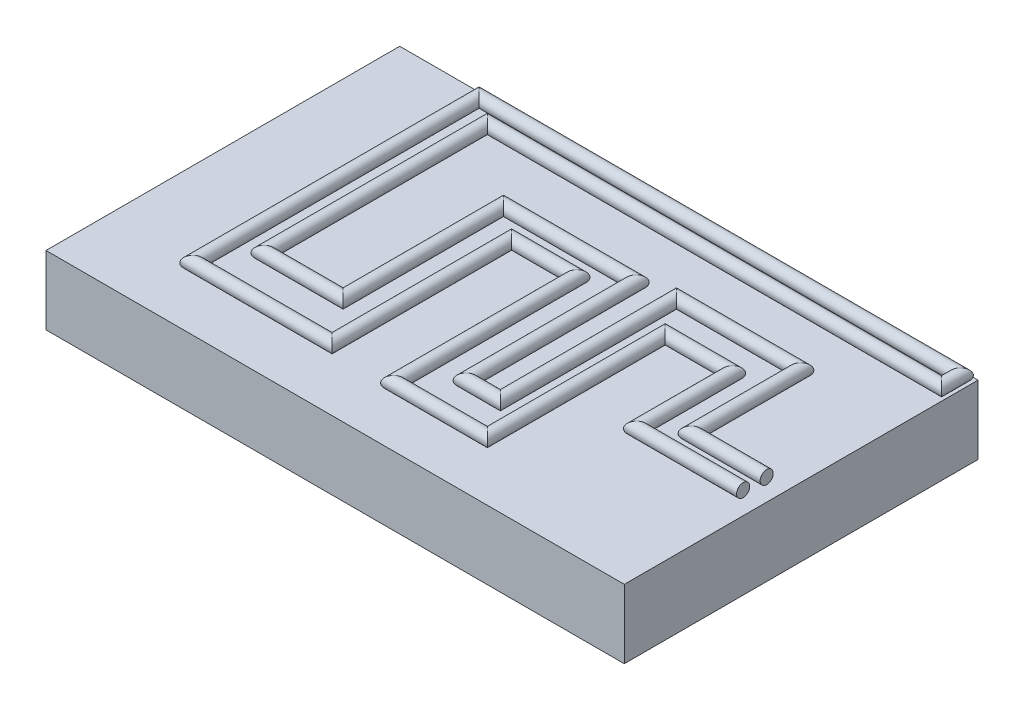
ISO-10303-21;
HEADER;
FILE_DESCRIPTION(('STEP AP214'),'2;1');
FILE_NAME('part.step','',(''),(''),'','','');
FILE_SCHEMA(('AUTOMOTIVE_DESIGN { 1 0 10303 214 1 1 1 1 }'));
ENDSEC;
DATA;
#1=APPLICATION_CONTEXT('core data for automotive mechanical design processes');
#2=APPLICATION_PROTOCOL_DEFINITION('international standard','automotive_design',2000,#1);
#3=PRODUCT_CONTEXT('',#1,'mechanical');
#4=PRODUCT('Part','Part','',(#3));
#5=PRODUCT_RELATED_PRODUCT_CATEGORY('part','',(#4));
#6=PRODUCT_DEFINITION_FORMATION('','',#4);
#7=PRODUCT_DEFINITION_CONTEXT('part definition',#1,'design');
#8=PRODUCT_DEFINITION('design','',#6,#7);
#9=PRODUCT_DEFINITION_SHAPE('','',#8);
#10=(LENGTH_UNIT() NAMED_UNIT(*) SI_UNIT(.MILLI.,.METRE.));
#11=(NAMED_UNIT(*) PLANE_ANGLE_UNIT() SI_UNIT($,.RADIAN.));
#12=(NAMED_UNIT(*) SI_UNIT($,.STERADIAN.) SOLID_ANGLE_UNIT());
#13=UNCERTAINTY_MEASURE_WITH_UNIT(LENGTH_MEASURE(1.E-05),#10,'distance_accuracy_value','');
#14=(GEOMETRIC_REPRESENTATION_CONTEXT(3) GLOBAL_UNCERTAINTY_ASSIGNED_CONTEXT((#13)) GLOBAL_UNIT_ASSIGNED_CONTEXT((#10,
#11,#12)) REPRESENTATION_CONTEXT('',''));
#15=CARTESIAN_POINT('',(0.,0.,0.));
#16=DIRECTION('',(0.,0.,1.));
#17=DIRECTION('',(1.,0.,0.));
#18=AXIS2_PLACEMENT_3D('',#15,#16,#17);
#19=CARTESIAN_POINT('',(61.7814006041099,9.64904990568815,-15.2359557336664));
#20=DIRECTION('',(-1.,0.,0.));
#21=DIRECTION('',(0.,-1.,0.));
#22=AXIS2_PLACEMENT_3D('',#19,#20,#21);
#23=PLANE('',#22);
#24=CARTESIAN_POINT('',(61.7814006041099,9.64904990568815,-15.2359557336664));
#25=DIRECTION('',(-1.,0.,0.));
#26=DIRECTION('',(0.,-1.,0.));
#27=AXIS2_PLACEMENT_3D('',#24,#25,#26);
#28=CIRCLE('',#27,0.699999999999999);
#29=CARTESIAN_POINT('',(61.7814006041099,8.94904990568815,-15.2359557336664));
#30=VERTEX_POINT('',#29);
#31=EDGE_CURVE('E68',#30,#30,#28,.T.);
#32=ORIENTED_EDGE('',*,*,#31,.F.);
#33=EDGE_LOOP('',(#32));
#34=FACE_BOUND('',#33,.T.);
#35=ADVANCED_FACE('F63',(#34),#23,.F.);
#36=CARTESIAN_POINT('',(61.733496817494,9.64904990568808,-12.7677870986393));
#37=DIRECTION('',(1.,0.,0.));
#38=DIRECTION('',(0.,-1.,0.));
#39=AXIS2_PLACEMENT_3D('',#36,#37,#38);
#40=PLANE('',#39);
#41=CARTESIAN_POINT('',(61.733496817494,9.64904990568808,-12.7677870986393));
#42=DIRECTION('',(1.,0.,0.));
#43=DIRECTION('',(0.,-1.,0.));
#44=AXIS2_PLACEMENT_3D('',#41,#42,#43);
#45=CIRCLE('',#44,0.699999999999999);
#46=CARTESIAN_POINT('',(61.733496817494,8.94904990568808,-12.7677870986393));
#47=VERTEX_POINT('',#46);
#48=EDGE_CURVE('E75',#47,#47,#45,.T.);
#49=ORIENTED_EDGE('',*,*,#48,.T.);
#50=EDGE_LOOP('',(#49));
#51=FACE_BOUND('',#50,.T.);
#52=ADVANCED_FACE('F149',(#51),#40,.T.);
#53=CARTESIAN_POINT('',(52.077721611781,9.64904990568816,-15.2359557336664));
#54=DIRECTION('',(1.,0.,0.));
#55=DIRECTION('',(0.,1.,0.));
#56=AXIS2_PLACEMENT_3D('',#53,#54,#55);
#57=CYLINDRICAL_SURFACE('',#56,0.699999999999999);
#58=CARTESIAN_POINT('',(53.717721611781,9.64904990568816,-15.2359557336664));
#59=DIRECTION('',(0.707106781186547,0.,0.707106781186547));
#60=DIRECTION('',(-0.707106781186548,0.,0.707106781186548));
#61=AXIS2_PLACEMENT_3D('',#58,#59,#60);
#62=ELLIPSE('',#61,0.989949493661166,0.699999999999999);
#63=CARTESIAN_POINT('',(53.017721611781,9.64904990568816,-14.5359557336664));
#64=VERTEX_POINT('',#63);
#65=EDGE_CURVE('E136',#64,#64,#62,.T.);
#66=ORIENTED_EDGE('',*,*,#65,.T.);
#67=EDGE_LOOP('',(#66));
#68=FACE_BOUND('',#67,.T.);
#69=ORIENTED_EDGE('',*,*,#31,.T.);
#70=EDGE_LOOP('',(#69));
#71=FACE_BOUND('',#70,.T.);
#72=ADVANCED_FACE('F143',(#68,#71),#57,.T.);
#73=CARTESIAN_POINT('',(53.717721611781,9.64904990568816,-28.5779597002349));
#74=DIRECTION('',(0.,0.,1.));
#75=DIRECTION('',(1.,0.,0.));
#76=AXIS2_PLACEMENT_3D('',#73,#74,#75);
#77=CYLINDRICAL_SURFACE('',#76,0.699999999999999);
#78=CARTESIAN_POINT('',(53.717721611781,9.64904990568818,-26.9379597002349));
#79=DIRECTION('',(0.707106781186548,0.,0.707106781186548));
#80=DIRECTION('',(0.707106781186548,0.,-0.707106781186548));
#81=AXIS2_PLACEMENT_3D('',#78,#79,#80);
#82=ELLIPSE('',#81,0.989949493661165,0.699999999999999);
#83=CARTESIAN_POINT('',(54.417721611781,9.64904990568818,-27.6379597002349));
#84=VERTEX_POINT('',#83);
#85=EDGE_CURVE('E138',#84,#84,#82,.T.);
#86=ORIENTED_EDGE('',*,*,#85,.T.);
#87=EDGE_LOOP('',(#86));
#88=FACE_BOUND('',#87,.T.);
#89=ORIENTED_EDGE('',*,*,#65,.F.);
#90=EDGE_LOOP('',(#89));
#91=FACE_BOUND('',#90,.T.);
#92=ADVANCED_FACE('F239',(#88,#91),#77,.T.);
#93=CARTESIAN_POINT('',(38.7958534336683,9.64904990568819,-26.9379597002349));
#94=DIRECTION('',(1.,0.,0.));
#95=DIRECTION('',(0.,1.,0.));
#96=AXIS2_PLACEMENT_3D('',#93,#94,#95);
#97=CYLINDRICAL_SURFACE('',#96,0.699999999999999);
#98=CARTESIAN_POINT('',(40.4358534336683,9.64904990568819,-26.9379597002349));
#99=DIRECTION('',(0.707106781186547,0.,-0.707106781186547));
#100=DIRECTION('',(-0.707106781186548,0.,-0.707106781186548));
#101=AXIS2_PLACEMENT_3D('',#98,#99,#100);
#102=ELLIPSE('',#101,0.989949493661165,0.699999999999999);
#103=CARTESIAN_POINT('',(39.7358534336683,9.64904990568819,-27.6379597002349));
#104=VERTEX_POINT('',#103);
#105=EDGE_CURVE('E133',#104,#104,#102,.T.);
#106=ORIENTED_EDGE('',*,*,#105,.T.);
#107=EDGE_LOOP('',(#106));
#108=FACE_BOUND('',#107,.T.);
#109=ORIENTED_EDGE('',*,*,#85,.F.);
#110=EDGE_LOOP('',(#109));
#111=FACE_BOUND('',#110,.T.);
#112=ADVANCED_FACE('F236',(#108,#111),#97,.T.);
#113=CARTESIAN_POINT('',(40.4358534336683,9.64904990568822,-6.48197978124197));
#114=DIRECTION('',(0.,0.,-1.));
#115=DIRECTION('',(0.,1.,0.));
#116=AXIS2_PLACEMENT_3D('',#113,#114,#115);
#117=CYLINDRICAL_SURFACE('',#116,0.699999999999999);
#118=CARTESIAN_POINT('',(40.4358534336683,9.64904990568814,-8.12197978124198));
#119=DIRECTION('',(0.707106781186548,0.,-0.707106781186548));
#120=DIRECTION('',(0.707106781186548,0.,0.707106781186548));
#121=AXIS2_PLACEMENT_3D('',#118,#119,#120);
#122=ELLIPSE('',#121,0.989949493661165,0.699999999999999);
#123=CARTESIAN_POINT('',(41.1358534336683,9.64904990568814,-7.42197978124198));
#124=VERTEX_POINT('',#123);
#125=EDGE_CURVE('E128',#124,#124,#122,.T.);
#126=ORIENTED_EDGE('',*,*,#125,.T.);
#127=EDGE_LOOP('',(#126));
#128=FACE_BOUND('',#127,.T.);
#129=ORIENTED_EDGE('',*,*,#105,.F.);
#130=EDGE_LOOP('',(#129));
#131=FACE_BOUND('',#130,.T.);
#132=ADVANCED_FACE('F235',(#128,#131),#117,.T.);
#133=CARTESIAN_POINT('',(35.1433396846874,9.64904990568814,-8.12197978124198));
#134=DIRECTION('',(1.,0.,0.));
#135=DIRECTION('',(0.,0.,-1.));
#136=AXIS2_PLACEMENT_3D('',#133,#134,#135);
#137=CYLINDRICAL_SURFACE('',#136,0.699999999999999);
#138=CARTESIAN_POINT('',(36.7833396846874,9.64904990568814,-8.12197978124198));
#139=DIRECTION('',(0.707106781186547,0.,0.707106781186547));
#140=DIRECTION('',(-0.707106781186548,0.,0.707106781186548));
#141=AXIS2_PLACEMENT_3D('',#138,#139,#140);
#142=ELLIPSE('',#141,0.989949493661165,0.699999999999999);
#143=CARTESIAN_POINT('',(36.0833396846874,9.64904990568814,-7.42197978124198));
#144=VERTEX_POINT('',#143);
#145=EDGE_CURVE('E130',#144,#144,#142,.T.);
#146=ORIENTED_EDGE('',*,*,#145,.T.);
#147=EDGE_LOOP('',(#146));
#148=FACE_BOUND('',#147,.T.);
#149=ORIENTED_EDGE('',*,*,#125,.F.);
#150=EDGE_LOOP('',(#149));
#151=FACE_BOUND('',#150,.T.);
#152=ADVANCED_FACE('F226',(#148,#151),#137,.T.);
#153=CARTESIAN_POINT('',(36.7833396846874,9.64904990568814,-27.9138662913293));
#154=DIRECTION('',(0.,0.,1.));
#155=DIRECTION('',(1.,0.,0.));
#156=AXIS2_PLACEMENT_3D('',#153,#154,#155);
#157=CYLINDRICAL_SURFACE('',#156,0.699999999999999);
#158=CARTESIAN_POINT('',(36.7833396846874,9.64904990568827,-26.2738662913293));
#159=DIRECTION('',(0.707106781186548,0.,0.707106781186548));
#160=DIRECTION('',(0.707106781186548,0.,-0.707106781186548));
#161=AXIS2_PLACEMENT_3D('',#158,#159,#160);
#162=ELLIPSE('',#161,0.989949493661165,0.699999999999999);
#163=CARTESIAN_POINT('',(37.4833396846874,9.64904990568827,-26.9738662913293));
#164=VERTEX_POINT('',#163);
#165=EDGE_CURVE('E121',#164,#164,#162,.T.);
#166=ORIENTED_EDGE('',*,*,#165,.T.);
#167=EDGE_LOOP('',(#166));
#168=FACE_BOUND('',#167,.T.);
#169=ORIENTED_EDGE('',*,*,#145,.F.);
#170=EDGE_LOOP('',(#169));
#171=FACE_BOUND('',#170,.T.);
#172=ADVANCED_FACE('F224',(#168,#171),#157,.T.);
#173=CARTESIAN_POINT('',(20.9760136280338,9.6490499056883,-26.2738662913293));
#174=DIRECTION('',(1.,0.,0.));
#175=DIRECTION('',(0.,1.,0.));
#176=AXIS2_PLACEMENT_3D('',#173,#174,#175);
#177=CYLINDRICAL_SURFACE('',#176,0.699999999999999);
#178=CARTESIAN_POINT('',(22.6160136280338,9.6490499056883,-26.2738662913293));
#179=DIRECTION('',(0.707106781186548,0.,-0.707106781186548));
#180=DIRECTION('',(-0.707106781186548,0.,-0.707106781186548));
#181=AXIS2_PLACEMENT_3D('',#178,#179,#180);
#182=ELLIPSE('',#181,0.989949493661165,0.699999999999999);
#183=CARTESIAN_POINT('',(21.9160136280338,9.6490499056883,-26.9738662913293));
#184=VERTEX_POINT('',#183);
#185=EDGE_CURVE('E122',#184,#184,#182,.T.);
#186=ORIENTED_EDGE('',*,*,#185,.T.);
#187=EDGE_LOOP('',(#186));
#188=FACE_BOUND('',#187,.T.);
#189=ORIENTED_EDGE('',*,*,#165,.F.);
#190=EDGE_LOOP('',(#189));
#191=FACE_BOUND('',#190,.T.);
#192=ADVANCED_FACE('F216',(#188,#191),#177,.T.);
#193=CARTESIAN_POINT('',(22.6160136280338,9.64904990568831,-7.49352941180969));
#194=DIRECTION('',(0.,0.,-1.));
#195=DIRECTION('',(0.,1.,0.));
#196=AXIS2_PLACEMENT_3D('',#193,#194,#195);
#197=CYLINDRICAL_SURFACE('',#196,0.699999999999999);
#198=CARTESIAN_POINT('',(22.6160136280338,9.64904990568816,-9.1335294118097));
#199=DIRECTION('',(0.707106781186547,0.,-0.707106781186547));
#200=DIRECTION('',(0.707106781186548,0.,0.707106781186548));
#201=AXIS2_PLACEMENT_3D('',#198,#199,#200);
#202=ELLIPSE('',#201,0.989949493661165,0.699999999999999);
#203=CARTESIAN_POINT('',(23.3160136280338,9.64904990568816,-8.4335294118097));
#204=VERTEX_POINT('',#203);
#205=EDGE_CURVE('E117',#204,#204,#202,.T.);
#206=ORIENTED_EDGE('',*,*,#205,.T.);
#207=EDGE_LOOP('',(#206));
#208=FACE_BOUND('',#207,.T.);
#209=ORIENTED_EDGE('',*,*,#185,.F.);
#210=EDGE_LOOP('',(#209));
#211=FACE_BOUND('',#210,.T.);
#212=ADVANCED_FACE('F217',(#208,#211),#197,.T.);
#213=CARTESIAN_POINT('',(12.532794182189,9.64904990568816,-9.1335294118097));
#214=DIRECTION('',(1.,0.,0.));
#215=DIRECTION('',(0.,0.,-1.));
#216=AXIS2_PLACEMENT_3D('',#213,#214,#215);
#217=CYLINDRICAL_SURFACE('',#216,0.699999999999999);
#218=CARTESIAN_POINT('',(14.172794182189,9.64904990568816,-9.1335294118097));
#219=DIRECTION('',(0.707106781186547,0.,0.707106781186547));
#220=DIRECTION('',(-0.707106781186548,0.,0.707106781186548));
#221=AXIS2_PLACEMENT_3D('',#218,#219,#220);
#222=ELLIPSE('',#221,0.989949493661165,0.699999999999999);
#223=CARTESIAN_POINT('',(13.472794182189,9.64904990568816,-8.4335294118097));
#224=VERTEX_POINT('',#223);
#225=EDGE_CURVE('E114',#224,#224,#222,.T.);
#226=ORIENTED_EDGE('',*,*,#225,.T.);
#227=EDGE_LOOP('',(#226));
#228=FACE_BOUND('',#227,.T.);
#229=ORIENTED_EDGE('',*,*,#205,.F.);
#230=EDGE_LOOP('',(#229));
#231=FACE_BOUND('',#230,.T.);
#232=ADVANCED_FACE('F215',(#228,#231),#217,.T.);
#233=CARTESIAN_POINT('',(14.172794182189,9.64904990568816,-34.6319326106471));
#234=DIRECTION('',(0.,0.,1.));
#235=DIRECTION('',(0.,-1.,0.));
#236=AXIS2_PLACEMENT_3D('',#233,#234,#235);
#237=CYLINDRICAL_SURFACE('',#236,0.699999999999999);
#238=CARTESIAN_POINT('',(14.172794182189,9.64904990568816,-32.9919326106471));
#239=DIRECTION('',(-0.707106781186548,0.,0.707106781186548));
#240=DIRECTION('',(-0.707106781186548,0.,-0.707106781186548));
#241=AXIS2_PLACEMENT_3D('',#238,#239,#240);
#242=ELLIPSE('',#241,0.989949493661165,0.699999999999999);
#243=CARTESIAN_POINT('',(13.472794182189,9.64904990568816,-33.6919326106471));
#244=VERTEX_POINT('',#243);
#245=EDGE_CURVE('E115',#244,#244,#242,.T.);
#246=ORIENTED_EDGE('',*,*,#245,.T.);
#247=EDGE_LOOP('',(#246));
#248=FACE_BOUND('',#247,.T.);
#249=ORIENTED_EDGE('',*,*,#225,.F.);
#250=EDGE_LOOP('',(#249));
#251=FACE_BOUND('',#250,.T.);
#252=ADVANCED_FACE('F206',(#248,#251),#237,.T.);
#253=CARTESIAN_POINT('',(64.3599678599309,9.64904990568817,-32.9919326106471));
#254=DIRECTION('',(-1.,0.,0.));
#255=DIRECTION('',(0.,-1.,0.));
#256=AXIS2_PLACEMENT_3D('',#253,#254,#255);
#257=CYLINDRICAL_SURFACE('',#256,0.699999999999999);
#258=CARTESIAN_POINT('',(62.7199678599309,9.64904990568816,-32.9919326106471));
#259=DIRECTION('',(-0.707106781186547,0.,0.707106781186547));
#260=DIRECTION('',(0.707106781186548,0.,0.707106781186548));
#261=AXIS2_PLACEMENT_3D('',#258,#259,#260);
#262=ELLIPSE('',#261,0.989949493661165,0.699999999999999);
#263=CARTESIAN_POINT('',(63.419967859931,9.64904990568816,-32.2919326106471));
#264=VERTEX_POINT('',#263);
#265=EDGE_CURVE('E107',#264,#264,#262,.T.);
#266=ORIENTED_EDGE('',*,*,#265,.T.);
#267=EDGE_LOOP('',(#266));
#268=FACE_BOUND('',#267,.T.);
#269=ORIENTED_EDGE('',*,*,#245,.F.);
#270=EDGE_LOOP('',(#269));
#271=FACE_BOUND('',#270,.T.);
#272=ADVANCED_FACE('F204',(#268,#271),#257,.T.);
#273=CARTESIAN_POINT('',(62.7199678599309,9.64904990568817,-36.6319326106472));
#274=DIRECTION('',(0.,0.,1.));
#275=DIRECTION('',(0.,-1.,0.));
#276=AXIS2_PLACEMENT_3D('',#273,#274,#275);
#277=CYLINDRICAL_SURFACE('',#276,0.699999999999999);
#278=CARTESIAN_POINT('',(62.719967859931,9.64904990568809,-34.9919326106473));
#279=DIRECTION('',(0.707106781186548,0.,0.707106781186548));
#280=DIRECTION('',(0.707106781186548,0.,-0.707106781186548));
#281=AXIS2_PLACEMENT_3D('',#278,#279,#280);
#282=ELLIPSE('',#281,0.989949493661165,0.699999999999999);
#283=CARTESIAN_POINT('',(63.419967859931,9.64904990568809,-35.6919326106473));
#284=VERTEX_POINT('',#283);
#285=EDGE_CURVE('E106',#284,#284,#282,.T.);
#286=ORIENTED_EDGE('',*,*,#285,.T.);
#287=EDGE_LOOP('',(#286));
#288=FACE_BOUND('',#287,.T.);
#289=ORIENTED_EDGE('',*,*,#265,.F.);
#290=EDGE_LOOP('',(#289));
#291=FACE_BOUND('',#290,.T.);
#292=ADVANCED_FACE('F196',(#288,#291),#277,.T.);
#293=CARTESIAN_POINT('',(9.65274383740777,9.64904990568809,-34.9919326106473));
#294=DIRECTION('',(1.,0.,0.));
#295=DIRECTION('',(0.,1.,0.));
#296=AXIS2_PLACEMENT_3D('',#293,#294,#295);
#297=CYLINDRICAL_SURFACE('',#296,0.699999999999999);
#298=CARTESIAN_POINT('',(11.2927438374078,9.64904990568809,-34.9919326106473));
#299=DIRECTION('',(0.707106781186548,0.,-0.707106781186548));
#300=DIRECTION('',(-0.707106781186548,0.,-0.707106781186548));
#301=AXIS2_PLACEMENT_3D('',#298,#299,#300);
#302=ELLIPSE('',#301,0.989949493661165,0.699999999999999);
#303=CARTESIAN_POINT('',(10.5927438374078,9.64904990568809,-35.6919326106473));
#304=VERTEX_POINT('',#303);
#305=EDGE_CURVE('E101',#304,#304,#302,.T.);
#306=ORIENTED_EDGE('',*,*,#305,.T.);
#307=EDGE_LOOP('',(#306));
#308=FACE_BOUND('',#307,.T.);
#309=ORIENTED_EDGE('',*,*,#285,.F.);
#310=EDGE_LOOP('',(#309));
#311=FACE_BOUND('',#310,.T.);
#312=ADVANCED_FACE('F197',(#308,#311),#297,.T.);
#313=CARTESIAN_POINT('',(11.2927438374078,9.64904990568809,-2.76594791703282));
#314=DIRECTION('',(0.,0.,-1.));
#315=DIRECTION('',(0.,1.,0.));
#316=AXIS2_PLACEMENT_3D('',#313,#314,#315);
#317=CYLINDRICAL_SURFACE('',#316,0.699999999999999);
#318=CARTESIAN_POINT('',(11.2927438374078,9.64904990568809,-4.40594791703283));
#319=DIRECTION('',(-0.707106781186548,0.,-0.707106781186548));
#320=DIRECTION('',(-0.707106781186548,0.,0.707106781186548));
#321=AXIS2_PLACEMENT_3D('',#318,#319,#320);
#322=ELLIPSE('',#321,0.989949493661165,0.699999999999999);
#323=CARTESIAN_POINT('',(10.5927438374078,9.64904990568809,-3.70594791703283));
#324=VERTEX_POINT('',#323);
#325=EDGE_CURVE('E99',#324,#324,#322,.T.);
#326=ORIENTED_EDGE('',*,*,#325,.T.);
#327=EDGE_LOOP('',(#326));
#328=FACE_BOUND('',#327,.T.);
#329=ORIENTED_EDGE('',*,*,#305,.F.);
#330=EDGE_LOOP('',(#329));
#331=FACE_BOUND('',#330,.T.);
#332=ADVANCED_FACE('F195',(#328,#331),#317,.T.);
#333=CARTESIAN_POINT('',(27.806945095669,9.64904990568809,-4.40594791703283));
#334=DIRECTION('',(-1.,0.,0.));
#335=DIRECTION('',(0.,-1.,0.));
#336=AXIS2_PLACEMENT_3D('',#333,#334,#335);
#337=CYLINDRICAL_SURFACE('',#336,0.699999999999999);
#338=CARTESIAN_POINT('',(26.166945095669,9.64904990568809,-4.40594791703283));
#339=DIRECTION('',(-0.707106781186548,0.,0.707106781186548));
#340=DIRECTION('',(0.707106781186548,0.,0.707106781186548));
#341=AXIS2_PLACEMENT_3D('',#338,#339,#340);
#342=ELLIPSE('',#341,0.989949493661165,0.699999999999999);
#343=CARTESIAN_POINT('',(26.866945095669,9.64904990568809,-3.70594791703283));
#344=VERTEX_POINT('',#343);
#345=EDGE_CURVE('E97',#344,#344,#342,.T.);
#346=ORIENTED_EDGE('',*,*,#345,.T.);
#347=EDGE_LOOP('',(#346));
#348=FACE_BOUND('',#347,.T.);
#349=ORIENTED_EDGE('',*,*,#325,.F.);
#350=EDGE_LOOP('',(#349));
#351=FACE_BOUND('',#350,.T.);
#352=ADVANCED_FACE('F189',(#348,#351),#337,.T.);
#353=CARTESIAN_POINT('',(26.166945095669,9.6490499056881,-25.2266852486562));
#354=DIRECTION('',(0.,0.,1.));
#355=DIRECTION('',(0.,-1.,0.));
#356=AXIS2_PLACEMENT_3D('',#353,#354,#355);
#357=CYLINDRICAL_SURFACE('',#356,0.699999999999999);
#358=CARTESIAN_POINT('',(26.166945095669,9.6490499056881,-23.5866852486562));
#359=DIRECTION('',(-0.707106781186548,0.,0.707106781186548));
#360=DIRECTION('',(-0.707106781186548,0.,-0.707106781186548));
#361=AXIS2_PLACEMENT_3D('',#358,#359,#360);
#362=ELLIPSE('',#361,0.989949493661165,0.699999999999999);
#363=CARTESIAN_POINT('',(25.466945095669,9.6490499056881,-24.2866852486562));
#364=VERTEX_POINT('',#363);
#365=EDGE_CURVE('E94',#364,#364,#362,.T.);
#366=ORIENTED_EDGE('',*,*,#365,.T.);
#367=EDGE_LOOP('',(#366));
#368=FACE_BOUND('',#367,.T.);
#369=ORIENTED_EDGE('',*,*,#345,.F.);
#370=EDGE_LOOP('',(#369));
#371=FACE_BOUND('',#370,.T.);
#372=ADVANCED_FACE('F183',(#368,#371),#357,.T.);
#373=CARTESIAN_POINT('',(34.7801472446931,9.6490499056881,-23.5866852486562));
#374=DIRECTION('',(-1.,0.,0.));
#375=DIRECTION('',(0.,0.,1.));
#376=AXIS2_PLACEMENT_3D('',#373,#374,#375);
#377=CYLINDRICAL_SURFACE('',#376,0.699999999999999);
#378=CARTESIAN_POINT('',(33.1401472446931,9.6490499056881,-23.5866852486562));
#379=DIRECTION('',(-0.707106781186548,0.,-0.707106781186548));
#380=DIRECTION('',(0.707106781186548,0.,-0.707106781186548));
#381=AXIS2_PLACEMENT_3D('',#378,#379,#380);
#382=ELLIPSE('',#381,0.989949493661165,0.699999999999999);
#383=CARTESIAN_POINT('',(33.8401472446931,9.6490499056881,-24.2866852486562));
#384=VERTEX_POINT('',#383);
#385=EDGE_CURVE('E93',#384,#384,#382,.T.);
#386=ORIENTED_EDGE('',*,*,#385,.T.);
#387=EDGE_LOOP('',(#386));
#388=FACE_BOUND('',#387,.T.);
#389=ORIENTED_EDGE('',*,*,#365,.F.);
#390=EDGE_LOOP('',(#389));
#391=FACE_BOUND('',#390,.T.);
#392=ADVANCED_FACE('F179',(#388,#391),#377,.T.);
#393=CARTESIAN_POINT('',(33.1401472446931,9.64904990568812,-2.37673083042692));
#394=DIRECTION('',(0.,0.,-1.));
#395=DIRECTION('',(0.,1.,0.));
#396=AXIS2_PLACEMENT_3D('',#393,#394,#395);
#397=CYLINDRICAL_SURFACE('',#396,0.699999999999999);
#398=CARTESIAN_POINT('',(33.1401472446931,9.64904990568812,-4.01673083042692));
#399=DIRECTION('',(-0.707106781186547,0.,-0.707106781186547));
#400=DIRECTION('',(-0.707106781186548,0.,0.707106781186548));
#401=AXIS2_PLACEMENT_3D('',#398,#399,#400);
#402=ELLIPSE('',#401,0.989949493661165,0.699999999999999);
#403=CARTESIAN_POINT('',(32.4401472446931,9.64904990568812,-3.31673083042692));
#404=VERTEX_POINT('',#403);
#405=EDGE_CURVE('E88',#404,#404,#402,.T.);
#406=ORIENTED_EDGE('',*,*,#405,.T.);
#407=EDGE_LOOP('',(#406));
#408=FACE_BOUND('',#407,.T.);
#409=ORIENTED_EDGE('',*,*,#385,.F.);
#410=EDGE_LOOP('',(#409));
#411=FACE_BOUND('',#410,.T.);
#412=ADVANCED_FACE('F176',(#408,#411),#397,.T.);
#413=CARTESIAN_POINT('',(44.7900664586152,9.64904990568812,-4.01673083042692));
#414=DIRECTION('',(-1.,0.,0.));
#415=DIRECTION('',(0.,0.,1.));
#416=AXIS2_PLACEMENT_3D('',#413,#414,#415);
#417=CYLINDRICAL_SURFACE('',#416,0.699999999999999);
#418=CARTESIAN_POINT('',(43.1500664586151,9.64904990568812,-4.01673083042692));
#419=DIRECTION('',(-0.707106781186548,0.,0.707106781186548));
#420=DIRECTION('',(0.707106781186548,0.,0.707106781186548));
#421=AXIS2_PLACEMENT_3D('',#418,#419,#420);
#422=ELLIPSE('',#421,0.989949493661165,0.699999999999999);
#423=CARTESIAN_POINT('',(43.8500664586151,9.64904990568812,-3.31673083042692));
#424=VERTEX_POINT('',#423);
#425=EDGE_CURVE('E83',#424,#424,#422,.T.);
#426=ORIENTED_EDGE('',*,*,#425,.T.);
#427=EDGE_LOOP('',(#426));
#428=FACE_BOUND('',#427,.T.);
#429=ORIENTED_EDGE('',*,*,#405,.F.);
#430=EDGE_LOOP('',(#429));
#431=FACE_BOUND('',#430,.T.);
#432=ADVANCED_FACE('F175',(#428,#431),#417,.T.);
#433=CARTESIAN_POINT('',(43.1500664586151,9.64904990568813,-24.6643302366381));
#434=DIRECTION('',(0.,0.,1.));
#435=DIRECTION('',(0.,-1.,0.));
#436=AXIS2_PLACEMENT_3D('',#433,#434,#435);
#437=CYLINDRICAL_SURFACE('',#436,0.699999999999999);
#438=CARTESIAN_POINT('',(43.1500664586152,9.64904990568813,-23.0243302366381));
#439=DIRECTION('',(-0.707106781186548,0.,0.707106781186548));
#440=DIRECTION('',(-0.707106781186548,0.,-0.707106781186548));
#441=AXIS2_PLACEMENT_3D('',#438,#439,#440);
#442=ELLIPSE('',#441,0.989949493661165,0.699999999999999);
#443=CARTESIAN_POINT('',(42.4500664586151,9.64904990568813,-23.7243302366381));
#444=VERTEX_POINT('',#443);
#445=EDGE_CURVE('E85',#444,#444,#442,.T.);
#446=ORIENTED_EDGE('',*,*,#445,.T.);
#447=EDGE_LOOP('',(#446));
#448=FACE_BOUND('',#447,.T.);
#449=ORIENTED_EDGE('',*,*,#425,.F.);
#450=EDGE_LOOP('',(#449));
#451=FACE_BOUND('',#450,.T.);
#452=ADVANCED_FACE('F166',(#448,#451),#437,.T.);
#453=CARTESIAN_POINT('',(51.9882106124464,9.64904990568813,-23.0243302366381));
#454=DIRECTION('',(-1.,0.,0.));
#455=DIRECTION('',(0.,0.,1.));
#456=AXIS2_PLACEMENT_3D('',#453,#454,#455);
#457=CYLINDRICAL_SURFACE('',#456,0.699999999999999);
#458=CARTESIAN_POINT('',(50.3482106124464,9.64904990568813,-23.0243302366381));
#459=DIRECTION('',(-0.707106781186547,0.,-0.707106781186547));
#460=DIRECTION('',(0.707106781186548,0.,-0.707106781186548));
#461=AXIS2_PLACEMENT_3D('',#458,#459,#460);
#462=ELLIPSE('',#461,0.989949493661166,0.699999999999999);
#463=CARTESIAN_POINT('',(51.0482106124464,9.64904990568813,-23.7243302366381));
#464=VERTEX_POINT('',#463);
#465=EDGE_CURVE('E80',#464,#464,#462,.T.);
#466=ORIENTED_EDGE('',*,*,#465,.T.);
#467=EDGE_LOOP('',(#466));
#468=FACE_BOUND('',#467,.T.);
#469=ORIENTED_EDGE('',*,*,#445,.F.);
#470=EDGE_LOOP('',(#469));
#471=FACE_BOUND('',#470,.T.);
#472=ADVANCED_FACE('F163',(#468,#471),#457,.T.);
#473=CARTESIAN_POINT('',(50.3482106124464,9.6490499056881,-11.1277870986393));
#474=DIRECTION('',(0.,0.,-1.));
#475=DIRECTION('',(0.,1.,0.));
#476=AXIS2_PLACEMENT_3D('',#473,#474,#475);
#477=CYLINDRICAL_SURFACE('',#476,0.699999999999999);
#478=CARTESIAN_POINT('',(50.3482106124464,9.64904990568811,-12.7677870986393));
#479=DIRECTION('',(-0.707106781186548,0.,-0.707106781186548));
#480=DIRECTION('',(-0.707106781186548,0.,0.707106781186548));
#481=AXIS2_PLACEMENT_3D('',#478,#479,#480);
#482=ELLIPSE('',#481,0.989949493661165,0.699999999999999);
#483=CARTESIAN_POINT('',(49.6482106124464,9.64904990568811,-12.0677870986393));
#484=VERTEX_POINT('',#483);
#485=EDGE_CURVE('E14',#484,#484,#482,.T.);
#486=ORIENTED_EDGE('',*,*,#485,.T.);
#487=EDGE_LOOP('',(#486));
#488=FACE_BOUND('',#487,.T.);
#489=ORIENTED_EDGE('',*,*,#465,.F.);
#490=EDGE_LOOP('',(#489));
#491=FACE_BOUND('',#490,.T.);
#492=ADVANCED_FACE('F151',(#488,#491),#477,.T.);
#493=CARTESIAN_POINT('',(61.733496817494,9.64904990568808,-12.7677870986393));
#494=DIRECTION('',(-1.,0.,0.));
#495=DIRECTION('',(0.,-1.,0.));
#496=AXIS2_PLACEMENT_3D('',#493,#494,#495);
#497=CYLINDRICAL_SURFACE('',#496,0.699999999999999);
#498=ORIENTED_EDGE('',*,*,#48,.F.);
#499=EDGE_LOOP('',(#498));
#500=FACE_BOUND('',#499,.T.);
#501=ORIENTED_EDGE('',*,*,#485,.F.);
#502=EDGE_LOOP('',(#501));
#503=FACE_BOUND('',#502,.T.);
#504=ADVANCED_FACE('F153',(#500,#503),#497,.T.);
#505=CLOSED_SHELL('',(#35,#52,#72,#92,#112,#132,#152,#172,#192,#212,#232,#252,#272,#292,#312,
#332,#352,#372,#392,#412,#432,#452,#472,#492,#504));
#506=MANIFOLD_SOLID_BREP('B2',#505);
#507=CARTESIAN_POINT('',(0.,7.35,0.));
#508=DIRECTION('',(1.,0.,0.));
#509=DIRECTION('',(0.,0.,-1.));
#510=AXIS2_PLACEMENT_3D('',#507,#508,#509);
#511=PLANE('',#510);
#512=DIRECTION('',(0.,0.,1.));
#513=VECTOR('',#512,1.);
#514=CARTESIAN_POINT('',(0.,0.,0.));
#515=LINE('',#514,#513);
#516=CARTESIAN_POINT('',(0.,0.,-37.8));
#517=VERTEX_POINT('',#516);
#518=CARTESIAN_POINT('',(0.,0.,0.));
#519=VERTEX_POINT('',#518);
#520=EDGE_CURVE('E497',#517,#519,#515,.T.);
#521=ORIENTED_EDGE('',*,*,#520,.T.);
#522=DIRECTION('',(0.,-1.,0.));
#523=VECTOR('',#522,1.);
#524=CARTESIAN_POINT('',(0.,7.35,0.));
#525=LINE('',#524,#523);
#526=CARTESIAN_POINT('',(0.,7.35,0.));
#527=VERTEX_POINT('',#526);
#528=EDGE_CURVE('E64',#527,#519,#525,.T.);
#529=ORIENTED_EDGE('',*,*,#528,.F.);
#530=DIRECTION('',(0.,0.,1.));
#531=VECTOR('',#530,1.);
#532=CARTESIAN_POINT('',(0.,7.35,0.));
#533=LINE('',#532,#531);
#534=CARTESIAN_POINT('',(0.,7.35,-37.8));
#535=VERTEX_POINT('',#534);
#536=EDGE_CURVE('E487',#535,#527,#533,.T.);
#537=ORIENTED_EDGE('',*,*,#536,.F.);
#538=DIRECTION('',(0.,-1.,0.));
#539=VECTOR('',#538,1.);
#540=CARTESIAN_POINT('',(0.,7.35,-37.8));
#541=LINE('',#540,#539);
#542=EDGE_CURVE('E492',#535,#517,#541,.T.);
#543=ORIENTED_EDGE('',*,*,#542,.T.);
#544=EDGE_LOOP('',(#521,#529,#537,#543));
#545=FACE_BOUND('',#544,.T.);
#546=ADVANCED_FACE('F436',(#545),#511,.F.);
#547=CARTESIAN_POINT('',(0.,7.35,0.));
#548=DIRECTION('',(0.,0.,-1.));
#549=DIRECTION('',(-1.,0.,0.));
#550=AXIS2_PLACEMENT_3D('',#547,#548,#549);
#551=PLANE('',#550);
#552=DIRECTION('',(1.,0.,0.));
#553=VECTOR('',#552,1.);
#554=CARTESIAN_POINT('',(0.,0.,0.));
#555=LINE('',#554,#553);
#556=CARTESIAN_POINT('',(61.8,0.,0.));
#557=VERTEX_POINT('',#556);
#558=EDGE_CURVE('E493',#519,#557,#555,.T.);
#559=ORIENTED_EDGE('',*,*,#558,.T.);
#560=DIRECTION('',(0.,-1.,0.));
#561=VECTOR('',#560,1.);
#562=CARTESIAN_POINT('',(61.8,7.35,0.));
#563=LINE('',#562,#561);
#564=CARTESIAN_POINT('',(61.8,7.35,0.));
#565=VERTEX_POINT('',#564);
#566=EDGE_CURVE('E443',#565,#557,#563,.T.);
#567=ORIENTED_EDGE('',*,*,#566,.F.);
#568=DIRECTION('',(1.,0.,0.));
#569=VECTOR('',#568,1.);
#570=CARTESIAN_POINT('',(0.,7.35,0.));
#571=LINE('',#570,#569);
#572=EDGE_CURVE('E485',#527,#565,#571,.T.);
#573=ORIENTED_EDGE('',*,*,#572,.F.);
#574=ORIENTED_EDGE('',*,*,#528,.T.);
#575=EDGE_LOOP('',(#559,#567,#573,#574));
#576=FACE_BOUND('',#575,.T.);
#577=ADVANCED_FACE('F489',(#576),#551,.F.);
#578=CARTESIAN_POINT('',(61.8,7.35,0.));
#579=DIRECTION('',(-1.,0.,0.));
#580=DIRECTION('',(0.,0.,1.));
#581=AXIS2_PLACEMENT_3D('',#578,#579,#580);
#582=PLANE('',#581);
#583=DIRECTION('',(0.,0.,-1.));
#584=VECTOR('',#583,1.);
#585=CARTESIAN_POINT('',(61.8,0.,0.));
#586=LINE('',#585,#584);
#587=CARTESIAN_POINT('',(61.8,0.,-37.8));
#588=VERTEX_POINT('',#587);
#589=EDGE_CURVE('E469',#557,#588,#586,.T.);
#590=ORIENTED_EDGE('',*,*,#589,.T.);
#591=DIRECTION('',(0.,-1.,0.));
#592=VECTOR('',#591,1.);
#593=CARTESIAN_POINT('',(61.8,7.35,-37.8));
#594=LINE('',#593,#592);
#595=CARTESIAN_POINT('',(61.8,7.35,-37.8));
#596=VERTEX_POINT('',#595);
#597=EDGE_CURVE('E495',#596,#588,#594,.T.);
#598=ORIENTED_EDGE('',*,*,#597,.F.);
#599=DIRECTION('',(0.,0.,-1.));
#600=VECTOR('',#599,1.);
#601=CARTESIAN_POINT('',(61.8,7.35,0.));
#602=LINE('',#601,#600);
#603=EDGE_CURVE('E482',#565,#596,#602,.T.);
#604=ORIENTED_EDGE('',*,*,#603,.F.);
#605=ORIENTED_EDGE('',*,*,#566,.T.);
#606=EDGE_LOOP('',(#590,#598,#604,#605));
#607=FACE_BOUND('',#606,.T.);
#608=ADVANCED_FACE('F491',(#607),#582,.F.);
#609=CARTESIAN_POINT('',(0.,7.35,-37.8));
#610=DIRECTION('',(0.,0.,1.));
#611=DIRECTION('',(1.,0.,0.));
#612=AXIS2_PLACEMENT_3D('',#609,#610,#611);
#613=PLANE('',#612);
#614=DIRECTION('',(-1.,0.,0.));
#615=VECTOR('',#614,1.);
#616=CARTESIAN_POINT('',(0.,0.,-37.8));
#617=LINE('',#616,#615);
#618=EDGE_CURVE('E473',#588,#517,#617,.T.);
#619=ORIENTED_EDGE('',*,*,#618,.T.);
#620=ORIENTED_EDGE('',*,*,#542,.F.);
#621=DIRECTION('',(-1.,0.,0.));
#622=VECTOR('',#621,1.);
#623=CARTESIAN_POINT('',(0.,7.35,-37.8));
#624=LINE('',#623,#622);
#625=EDGE_CURVE('E455',#596,#535,#624,.T.);
#626=ORIENTED_EDGE('',*,*,#625,.F.);
#627=ORIENTED_EDGE('',*,*,#597,.T.);
#628=EDGE_LOOP('',(#619,#620,#626,#627));
#629=FACE_BOUND('',#628,.T.);
#630=ADVANCED_FACE('F506',(#629),#613,.F.);
#631=CARTESIAN_POINT('',(0.,7.35,0.));
#632=DIRECTION('',(0.,-1.,0.));
#633=DIRECTION('',(0.,0.,-1.));
#634=AXIS2_PLACEMENT_3D('',#631,#632,#633);
#635=PLANE('',#634);
#636=ORIENTED_EDGE('',*,*,#536,.T.);
#637=ORIENTED_EDGE('',*,*,#572,.T.);
#638=ORIENTED_EDGE('',*,*,#603,.T.);
#639=ORIENTED_EDGE('',*,*,#625,.T.);
#640=EDGE_LOOP('',(#636,#637,#638,#639));
#641=FACE_BOUND('',#640,.T.);
#642=ADVANCED_FACE('F481',(#641),#635,.F.);
#643=CARTESIAN_POINT('',(0.,0.,0.));
#644=DIRECTION('',(0.,-1.,0.));
#645=DIRECTION('',(0.,0.,-1.));
#646=AXIS2_PLACEMENT_3D('',#643,#644,#645);
#647=PLANE('',#646);
#648=ORIENTED_EDGE('',*,*,#520,.F.);
#649=ORIENTED_EDGE('',*,*,#618,.F.);
#650=ORIENTED_EDGE('',*,*,#589,.F.);
#651=ORIENTED_EDGE('',*,*,#558,.F.);
#652=EDGE_LOOP('',(#648,#649,#650,#651));
#653=FACE_BOUND('',#652,.T.);
#654=ADVANCED_FACE('F508',(#653),#647,.T.);
#655=CLOSED_SHELL('',(#546,#577,#608,#630,#642,#654));
#656=MANIFOLD_SOLID_BREP('B9',#655);
#657=ADVANCED_BREP_SHAPE_REPRESENTATION('',(#18,#506,#656),#14);
#658=SHAPE_DEFINITION_REPRESENTATION(#9,#657);
ENDSEC;
END-ISO-10303-21;
